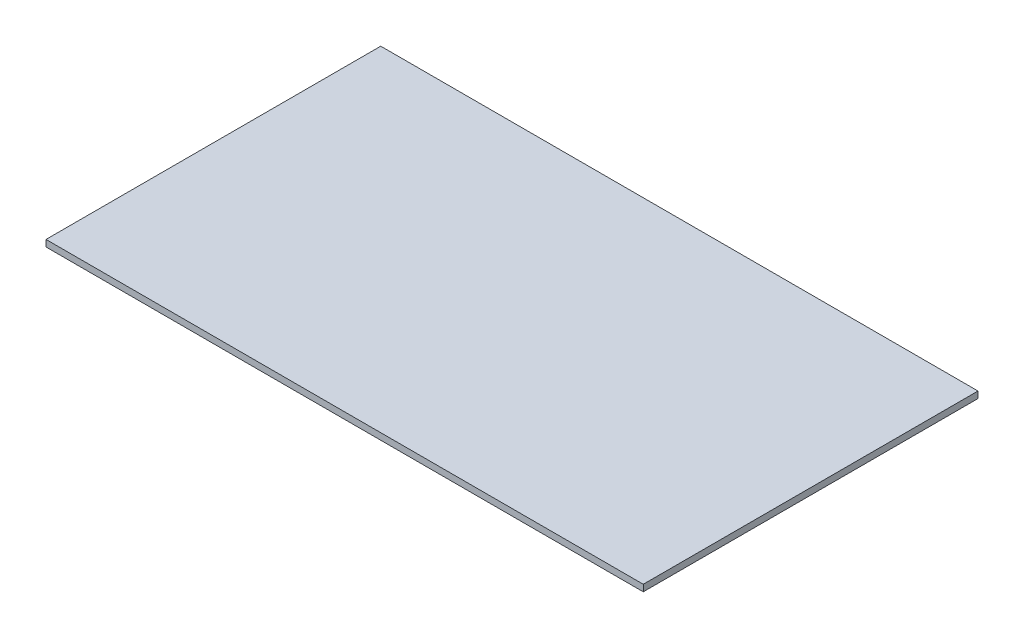
ISO-10303-21;
HEADER;
FILE_DESCRIPTION(('STEP AP214'),'2;1');
FILE_NAME('part.step','',(''),(''),'','','');
FILE_SCHEMA(('AUTOMOTIVE_DESIGN { 1 0 10303 214 1 1 1 1 }'));
ENDSEC;
DATA;
#1=APPLICATION_CONTEXT('core data for automotive mechanical design processes');
#2=APPLICATION_PROTOCOL_DEFINITION('international standard','automotive_design',2000,#1);
#3=PRODUCT_CONTEXT('',#1,'mechanical');
#4=PRODUCT('Part','Part','',(#3));
#5=PRODUCT_RELATED_PRODUCT_CATEGORY('part','',(#4));
#6=PRODUCT_DEFINITION_FORMATION('','',#4);
#7=PRODUCT_DEFINITION_CONTEXT('part definition',#1,'design');
#8=PRODUCT_DEFINITION('design','',#6,#7);
#9=PRODUCT_DEFINITION_SHAPE('','',#8);
#10=(LENGTH_UNIT() NAMED_UNIT(*) SI_UNIT(.MILLI.,.METRE.));
#11=(NAMED_UNIT(*) PLANE_ANGLE_UNIT() SI_UNIT($,.RADIAN.));
#12=(NAMED_UNIT(*) SI_UNIT($,.STERADIAN.) SOLID_ANGLE_UNIT());
#13=UNCERTAINTY_MEASURE_WITH_UNIT(LENGTH_MEASURE(1.E-05),#10,'distance_accuracy_value','');
#14=(GEOMETRIC_REPRESENTATION_CONTEXT(3) GLOBAL_UNCERTAINTY_ASSIGNED_CONTEXT((#13)) GLOBAL_UNIT_ASSIGNED_CONTEXT((#10,
#11,#12)) REPRESENTATION_CONTEXT('',''));
#15=CARTESIAN_POINT('',(0.,0.,0.));
#16=DIRECTION('',(0.,0.,1.));
#17=DIRECTION('',(1.,0.,0.));
#18=AXIS2_PLACEMENT_3D('',#15,#16,#17);
#19=CARTESIAN_POINT('',(227.5,5.,127.5));
#20=DIRECTION('',(-1.,0.,0.));
#21=DIRECTION('',(0.,0.,1.));
#22=AXIS2_PLACEMENT_3D('',#19,#20,#21);
#23=PLANE('',#22);
#24=DIRECTION('',(0.,0.,-1.));
#25=VECTOR('',#24,1.);
#26=CARTESIAN_POINT('',(227.5,0.,127.5));
#27=LINE('',#26,#25);
#28=CARTESIAN_POINT('',(227.5,0.,127.5));
#29=VERTEX_POINT('',#28);
#30=CARTESIAN_POINT('',(227.5,0.,-127.5));
#31=VERTEX_POINT('',#30);
#32=EDGE_CURVE('E98',#29,#31,#27,.T.);
#33=ORIENTED_EDGE('',*,*,#32,.T.);
#34=DIRECTION('',(0.,-1.,0.));
#35=VECTOR('',#34,1.);
#36=CARTESIAN_POINT('',(227.5,5.,-127.5));
#37=LINE('',#36,#35);
#38=CARTESIAN_POINT('',(227.5,5.,-127.5));
#39=VERTEX_POINT('',#38);
#40=EDGE_CURVE('E11',#39,#31,#37,.T.);
#41=ORIENTED_EDGE('',*,*,#40,.F.);
#42=DIRECTION('',(0.,0.,-1.));
#43=VECTOR('',#42,1.);
#44=CARTESIAN_POINT('',(227.5,5.,127.5));
#45=LINE('',#44,#43);
#46=CARTESIAN_POINT('',(227.5,5.,127.5));
#47=VERTEX_POINT('',#46);
#48=EDGE_CURVE('E86',#47,#39,#45,.T.);
#49=ORIENTED_EDGE('',*,*,#48,.F.);
#50=DIRECTION('',(0.,-1.,0.));
#51=VECTOR('',#50,1.);
#52=CARTESIAN_POINT('',(227.5,5.,127.5));
#53=LINE('',#52,#51);
#54=EDGE_CURVE('E94',#47,#29,#53,.T.);
#55=ORIENTED_EDGE('',*,*,#54,.T.);
#56=EDGE_LOOP('',(#33,#41,#49,#55));
#57=FACE_BOUND('',#56,.T.);
#58=ADVANCED_FACE('F35',(#57),#23,.F.);
#59=CARTESIAN_POINT('',(-227.5,5.,-127.5));
#60=DIRECTION('',(0.,0.,1.));
#61=DIRECTION('',(1.,0.,0.));
#62=AXIS2_PLACEMENT_3D('',#59,#60,#61);
#63=PLANE('',#62);
#64=DIRECTION('',(-1.,0.,0.));
#65=VECTOR('',#64,1.);
#66=CARTESIAN_POINT('',(-227.5,0.,-127.5));
#67=LINE('',#66,#65);
#68=CARTESIAN_POINT('',(-227.5,0.,-127.5));
#69=VERTEX_POINT('',#68);
#70=EDGE_CURVE('E90',#31,#69,#67,.T.);
#71=ORIENTED_EDGE('',*,*,#70,.T.);
#72=DIRECTION('',(0.,-1.,0.));
#73=VECTOR('',#72,1.);
#74=CARTESIAN_POINT('',(-227.5,5.,-127.5));
#75=LINE('',#74,#73);
#76=CARTESIAN_POINT('',(-227.5,5.,-127.5));
#77=VERTEX_POINT('',#76);
#78=EDGE_CURVE('E43',#77,#69,#75,.T.);
#79=ORIENTED_EDGE('',*,*,#78,.F.);
#80=DIRECTION('',(-1.,0.,0.));
#81=VECTOR('',#80,1.);
#82=CARTESIAN_POINT('',(-227.5,5.,-127.5));
#83=LINE('',#82,#81);
#84=EDGE_CURVE('E81',#39,#77,#83,.T.);
#85=ORIENTED_EDGE('',*,*,#84,.F.);
#86=ORIENTED_EDGE('',*,*,#40,.T.);
#87=EDGE_LOOP('',(#71,#79,#85,#86));
#88=FACE_BOUND('',#87,.T.);
#89=ADVANCED_FACE('F89',(#88),#63,.F.);
#90=CARTESIAN_POINT('',(-227.5,5.,127.5));
#91=DIRECTION('',(1.,0.,0.));
#92=DIRECTION('',(0.,0.,-1.));
#93=AXIS2_PLACEMENT_3D('',#90,#91,#92);
#94=PLANE('',#93);
#95=DIRECTION('',(0.,0.,1.));
#96=VECTOR('',#95,1.);
#97=CARTESIAN_POINT('',(-227.5,0.,127.5));
#98=LINE('',#97,#96);
#99=CARTESIAN_POINT('',(-227.5,0.,127.5));
#100=VERTEX_POINT('',#99);
#101=EDGE_CURVE('E68',#69,#100,#98,.T.);
#102=ORIENTED_EDGE('',*,*,#101,.T.);
#103=DIRECTION('',(0.,-1.,0.));
#104=VECTOR('',#103,1.);
#105=CARTESIAN_POINT('',(-227.5,5.,127.5));
#106=LINE('',#105,#104);
#107=CARTESIAN_POINT('',(-227.5,5.,127.5));
#108=VERTEX_POINT('',#107);
#109=EDGE_CURVE('E91',#108,#100,#106,.T.);
#110=ORIENTED_EDGE('',*,*,#109,.F.);
#111=DIRECTION('',(0.,0.,1.));
#112=VECTOR('',#111,1.);
#113=CARTESIAN_POINT('',(-227.5,5.,127.5));
#114=LINE('',#113,#112);
#115=EDGE_CURVE('E84',#77,#108,#114,.T.);
#116=ORIENTED_EDGE('',*,*,#115,.F.);
#117=ORIENTED_EDGE('',*,*,#78,.T.);
#118=EDGE_LOOP('',(#102,#110,#116,#117));
#119=FACE_BOUND('',#118,.T.);
#120=ADVANCED_FACE('F92',(#119),#94,.F.);
#121=CARTESIAN_POINT('',(-227.5,5.,127.5));
#122=DIRECTION('',(0.,0.,-1.));
#123=DIRECTION('',(-1.,0.,0.));
#124=AXIS2_PLACEMENT_3D('',#121,#122,#123);
#125=PLANE('',#124);
#126=DIRECTION('',(1.,0.,0.));
#127=VECTOR('',#126,1.);
#128=CARTESIAN_POINT('',(-227.5,0.,127.5));
#129=LINE('',#128,#127);
#130=EDGE_CURVE('E74',#100,#29,#129,.T.);
#131=ORIENTED_EDGE('',*,*,#130,.T.);
#132=ORIENTED_EDGE('',*,*,#54,.F.);
#133=DIRECTION('',(1.,0.,0.));
#134=VECTOR('',#133,1.);
#135=CARTESIAN_POINT('',(-227.5,5.,127.5));
#136=LINE('',#135,#134);
#137=EDGE_CURVE('E51',#108,#47,#136,.T.);
#138=ORIENTED_EDGE('',*,*,#137,.F.);
#139=ORIENTED_EDGE('',*,*,#109,.T.);
#140=EDGE_LOOP('',(#131,#132,#138,#139));
#141=FACE_BOUND('',#140,.T.);
#142=ADVANCED_FACE('F105',(#141),#125,.F.);
#143=CARTESIAN_POINT('',(0.,5.,0.));
#144=DIRECTION('',(0.,-1.,0.));
#145=DIRECTION('',(0.,0.,-1.));
#146=AXIS2_PLACEMENT_3D('',#143,#144,#145);
#147=PLANE('',#146);
#148=ORIENTED_EDGE('',*,*,#48,.T.);
#149=ORIENTED_EDGE('',*,*,#84,.T.);
#150=ORIENTED_EDGE('',*,*,#115,.T.);
#151=ORIENTED_EDGE('',*,*,#137,.T.);
#152=EDGE_LOOP('',(#148,#149,#150,#151));
#153=FACE_BOUND('',#152,.T.);
#154=ADVANCED_FACE('F82',(#153),#147,.F.);
#155=CARTESIAN_POINT('',(0.,0.,0.));
#156=DIRECTION('',(0.,-1.,0.));
#157=DIRECTION('',(0.,0.,-1.));
#158=AXIS2_PLACEMENT_3D('',#155,#156,#157);
#159=PLANE('',#158);
#160=ORIENTED_EDGE('',*,*,#32,.F.);
#161=ORIENTED_EDGE('',*,*,#130,.F.);
#162=ORIENTED_EDGE('',*,*,#101,.F.);
#163=ORIENTED_EDGE('',*,*,#70,.F.);
#164=EDGE_LOOP('',(#160,#161,#162,#163));
#165=FACE_BOUND('',#164,.T.);
#166=ADVANCED_FACE('F108',(#165),#159,.T.);
#167=CLOSED_SHELL('',(#58,#89,#120,#142,#154,#166));
#168=MANIFOLD_SOLID_BREP('B2',#167);
#169=ADVANCED_BREP_SHAPE_REPRESENTATION('',(#18,#168),#14);
#170=SHAPE_DEFINITION_REPRESENTATION(#9,#169);
ENDSEC;
END-ISO-10303-21;
